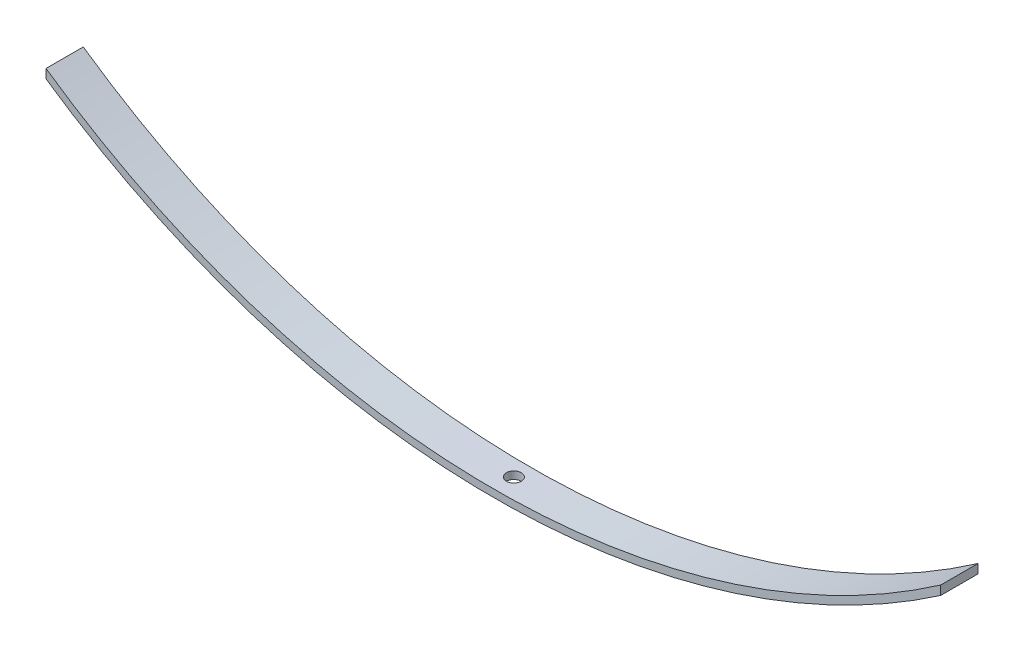
ISO-10303-21;
HEADER;
FILE_DESCRIPTION(('STEP AP214'),'2;1');
FILE_NAME('part.step','',(''),(''),'','','');
FILE_SCHEMA(('AUTOMOTIVE_DESIGN { 1 0 10303 214 1 1 1 1 }'));
ENDSEC;
DATA;
#1=APPLICATION_CONTEXT('core data for automotive mechanical design processes');
#2=APPLICATION_PROTOCOL_DEFINITION('international standard','automotive_design',2000,#1);
#3=PRODUCT_CONTEXT('',#1,'mechanical');
#4=PRODUCT('Part','Part','',(#3));
#5=PRODUCT_RELATED_PRODUCT_CATEGORY('part','',(#4));
#6=PRODUCT_DEFINITION_FORMATION('','',#4);
#7=PRODUCT_DEFINITION_CONTEXT('part definition',#1,'design');
#8=PRODUCT_DEFINITION('design','',#6,#7);
#9=PRODUCT_DEFINITION_SHAPE('','',#8);
#10=(LENGTH_UNIT() NAMED_UNIT(*) SI_UNIT(.MILLI.,.METRE.));
#11=(NAMED_UNIT(*) PLANE_ANGLE_UNIT() SI_UNIT($,.RADIAN.));
#12=(NAMED_UNIT(*) SI_UNIT($,.STERADIAN.) SOLID_ANGLE_UNIT());
#13=UNCERTAINTY_MEASURE_WITH_UNIT(LENGTH_MEASURE(1.E-05),#10,'distance_accuracy_value','');
#14=(GEOMETRIC_REPRESENTATION_CONTEXT(3) GLOBAL_UNCERTAINTY_ASSIGNED_CONTEXT((#13)) GLOBAL_UNIT_ASSIGNED_CONTEXT((#10,
#11,#12)) REPRESENTATION_CONTEXT('',''));
#15=CARTESIAN_POINT('',(0.,0.,0.));
#16=DIRECTION('',(0.,0.,1.));
#17=DIRECTION('',(1.,0.,0.));
#18=AXIS2_PLACEMENT_3D('',#15,#16,#17);
#19=CARTESIAN_POINT('',(-600.,-873.842090998139,50.));
#20=DIRECTION('',(-1.,0.,0.));
#21=DIRECTION('',(0.,-1.,0.));
#22=AXIS2_PLACEMENT_3D('',#19,#20,#21);
#23=PLANE('',#22);
#24=DIRECTION('',(0.,1.,0.));
#25=VECTOR('',#24,1.);
#26=CARTESIAN_POINT('',(-600.,-873.842090998139,0.));
#27=LINE('',#26,#25);
#28=CARTESIAN_POINT('',(-600.,-873.842090998139,0.));
#29=VERTEX_POINT('',#28);
#30=CARTESIAN_POINT('',(-600.,-861.684396980704,0.));
#31=VERTEX_POINT('',#30);
#32=EDGE_CURVE('E117',#29,#31,#27,.T.);
#33=ORIENTED_EDGE('',*,*,#32,.F.);
#34=DIRECTION('',(0.,0.,-1.));
#35=VECTOR('',#34,1.);
#36=CARTESIAN_POINT('',(-600.,-873.842090998139,50.));
#37=LINE('',#36,#35);
#38=CARTESIAN_POINT('',(-600.,-873.842090998139,50.));
#39=VERTEX_POINT('',#38);
#40=EDGE_CURVE('E11',#39,#29,#37,.T.);
#41=ORIENTED_EDGE('',*,*,#40,.F.);
#42=DIRECTION('',(0.,1.,0.));
#43=VECTOR('',#42,1.);
#44=CARTESIAN_POINT('',(-600.,-873.842090998139,50.));
#45=LINE('',#44,#43);
#46=CARTESIAN_POINT('',(-600.,-861.684396980704,50.));
#47=VERTEX_POINT('',#46);
#48=EDGE_CURVE('E109',#39,#47,#45,.T.);
#49=ORIENTED_EDGE('',*,*,#48,.T.);
#50=DIRECTION('',(0.,0.,-1.));
#51=VECTOR('',#50,1.);
#52=CARTESIAN_POINT('',(-600.,-861.684396980704,50.));
#53=LINE('',#52,#51);
#54=EDGE_CURVE('E85',#47,#31,#53,.T.);
#55=ORIENTED_EDGE('',*,*,#54,.T.);
#56=EDGE_LOOP('',(#33,#41,#49,#55));
#57=FACE_BOUND('',#56,.T.);
#58=ADVANCED_FACE('F39',(#57),#23,.T.);
#59=CARTESIAN_POINT('',(0.,0.,50.));
#60=DIRECTION('',(0.,0.,-1.));
#61=DIRECTION('',(-1.,0.,0.));
#62=AXIS2_PLACEMENT_3D('',#59,#60,#61);
#63=CYLINDRICAL_SURFACE('',#62,1060.);
#64=CARTESIAN_POINT('',(0.,-1060.,32.5));
#65=CARTESIAN_POINT('',(0.280946584348206,-1060.00000005311,32.5000020220934));
#66=CARTESIAN_POINT('',(0.56186000698558,-1059.99988806992,32.4881554885509));
#67=CARTESIAN_POINT('',(1.12178384017967,-1059.99944337889,32.4408520981594));
#68=CARTESIAN_POINT('',(1.40079373100566,-1059.99911061302,32.4053890348243));
#69=CARTESIAN_POINT('',(1.95512691926414,-1059.99823320531,32.3110456503398));
#70=CARTESIAN_POINT('',(2.23044597331775,-1059.99768833816,32.2521404262339));
#71=CARTESIAN_POINT('',(2.77514481562961,-1059.996402234,32.1113319083847));
#72=CARTESIAN_POINT('',(3.04452449859756,-1059.99566099352,32.0294282072885));
#73=CARTESIAN_POINT('',(3.5752887959038,-1059.9940036209,31.8432523644932));
#74=CARTESIAN_POINT('',(3.83667730994195,-1059.99308757571,31.7389913389032));
#75=CARTESIAN_POINT('',(4.34974481181648,-1059.99110634953,31.5088165525777));
#76=CARTESIAN_POINT('',(4.60142364640466,-1059.9900411662,31.382902450262));
#77=CARTESIAN_POINT('',(5.09321722992586,-1059.98779219393,31.1103516290593));
#78=CARTESIAN_POINT('',(5.33333480554242,-1059.98660843421,30.9637200103765));
#79=CARTESIAN_POINT('',(5.8003606571583,-1059.9841557098,30.6507563684889));
#80=CARTESIAN_POINT('',(6.02726921450707,-1059.98288674693,30.4844247651191));
#81=CARTESIAN_POINT('',(6.46630145618245,-1059.98029941738,30.1332156423847));
#82=CARTESIAN_POINT('',(6.67842302462288,-1059.97898104367,29.9483354780811));
#83=CARTESIAN_POINT('',(7.08633806907873,-1059.97633248349,29.561363072658));
#84=CARTESIAN_POINT('',(7.28213152827135,-1059.975002297,29.3592708138054));
#85=CARTESIAN_POINT('',(7.65600563784012,-1059.97236781821,28.9393027189671));
#86=CARTESIAN_POINT('',(7.8340855975412,-1059.97106352692,28.7214262681048));
#87=CARTESIAN_POINT('',(8.17125798978058,-1059.96851791795,28.2714456419832));
#88=CARTESIAN_POINT('',(8.33035042594166,-1059.96727660027,28.0393414694386));
#89=CARTESIAN_POINT('',(8.62841675297272,-1059.96489217678,27.5625553311994));
#90=CARTESIAN_POINT('',(8.76739064149245,-1059.963749071,27.3178733640354));
#91=CARTESIAN_POINT('',(9.02423174592911,-1059.96159352313,26.8176711092513));
#92=CARTESIAN_POINT('',(9.14209896111197,-1059.96058108105,26.5621508212542));
#93=CARTESIAN_POINT('',(9.35588838032539,-1059.95871560566,26.0420890694925));
#94=CARTESIAN_POINT('',(9.45181063206887,-1059.957862572,25.7775476253433));
#95=CARTESIAN_POINT('',(9.62102834409218,-1059.95634012899,25.2413238128445));
#96=CARTESIAN_POINT('',(9.69432380511083,-1059.95567071964,24.969641444728));
#97=CARTESIAN_POINT('',(9.81776495300685,-1059.95453454668,24.4210751591308));
#98=CARTESIAN_POINT('',(9.86791129425824,-1059.95406777733,24.1441913889122));
#99=CARTESIAN_POINT('',(9.94470064402974,-1059.95335010869,23.5871833899874));
#100=CARTESIAN_POINT('',(9.9713436529791,-1059.95309920939,23.3070591613404));
#101=CARTESIAN_POINT('',(10.0009368315469,-1059.9528204042,22.7455624456118));
#102=CARTESIAN_POINT('',(10.0038870484492,-1059.95279249787,22.4641899610224));
#103=CARTESIAN_POINT('',(9.98607378550728,-1059.9529604699,21.9021967050847));
#104=CARTESIAN_POINT('',(9.96531030609027,-1059.95315634825,21.6215759337227));
#105=CARTESIAN_POINT('',(9.90021834436419,-1059.95376631874,21.0630900864696));
#106=CARTESIAN_POINT('',(9.85589060514177,-1059.95418040401,20.7852249239632));
#107=CARTESIAN_POINT('',(9.74398580294951,-1059.95521502892,20.2342167248068));
#108=CARTESIAN_POINT('',(9.67640874052277,-1059.95583556856,19.9610736880465));
#109=CARTESIAN_POINT('',(9.51848572371814,-1059.95726548699,19.4214512112829));
#110=CARTESIAN_POINT('',(9.42813974349648,-1059.958074866,19.1549717788434));
#111=CARTESIAN_POINT('',(9.22532131348973,-1059.95985948679,18.6305711663604));
#112=CARTESIAN_POINT('',(9.11284886315724,-1059.96083472857,18.3726499865285));
#113=CARTESIAN_POINT('',(8.8665751949722,-1059.96292340768,17.8671953037659));
#114=CARTESIAN_POINT('',(8.73277363926302,-1059.96403684719,17.6196619654586));
#115=CARTESIAN_POINT('',(8.44479429713416,-1059.96637030295,17.1367468776052));
#116=CARTESIAN_POINT('',(8.29061651058448,-1059.9675903192,16.9013651281366));
#117=CARTESIAN_POINT('',(7.96298078682747,-1059.97010229707,16.4444264090993));
#118=CARTESIAN_POINT('',(7.78952285308146,-1059.97139425868,16.2228694370487));
#119=CARTESIAN_POINT('',(7.4245598551457,-1059.97401345524,15.7951550835713));
#120=CARTESIAN_POINT('',(7.23305479046283,-1059.97534069018,15.5889977025654));
#121=CARTESIAN_POINT('',(6.83335098118503,-1059.97799281239,15.1935401938286));
#122=CARTESIAN_POINT('',(6.62515158345991,-1059.97931769955,15.0042407262397));
#123=CARTESIAN_POINT('',(6.19354566028855,-1059.98192746531,14.6438538228687));
#124=CARTESIAN_POINT('',(5.97013913441568,-1059.98321234391,14.4727663875976));
#125=CARTESIAN_POINT('',(5.50970705525377,-1059.98570561966,14.1500198242902));
#126=CARTESIAN_POINT('',(5.27268149991302,-1059.98691401681,13.998360699181));
#127=CARTESIAN_POINT('',(4.7866963677902,-1059.98922002738,13.7155490281529));
#128=CARTESIAN_POINT('',(4.53773679115306,-1059.9903176408,13.584396481985));
#129=CARTESIAN_POINT('',(4.02965324006816,-1059.99237092721,13.3435303648615));
#130=CARTESIAN_POINT('',(3.77052925630749,-1059.99332660007,13.2338168135494));
#131=CARTESIAN_POINT('',(3.24395929545183,-1059.99506887533,13.0366089692603));
#132=CARTESIAN_POINT('',(2.97651331831506,-1059.99585547773,12.9491146763949));
#133=CARTESIAN_POINT('',(2.43520087718173,-1059.99723728213,12.7969675543235));
#134=CARTESIAN_POINT('',(2.16133441486457,-1059.99783248418,12.7323147191431));
#135=CARTESIAN_POINT('',(1.6091280955505,-1059.99881459158,12.6263102664249));
#136=CARTESIAN_POINT('',(1.33078823870042,-1059.99920149693,12.5849586481223));
#137=CARTESIAN_POINT('',(0.77162494237483,-1059.99975601669,12.5258518556675));
#138=CARTESIAN_POINT('',(0.490801599132531,-1059.99992363955,12.5080957712042));
#139=CARTESIAN_POINT('',(-0.071342710693692,-1060.00003486381,12.4963033565812));
#140=CARTESIAN_POINT('',(-0.352663677264907,-1059.9999784652,12.5022670258157));
#141=CARTESIAN_POINT('',(-0.91380311134412,-1059.99964324747,12.5378717052939));
#142=CARTESIAN_POINT('',(-1.19362157895722,-1059.99936442837,12.5675127138814));
#143=CARTESIAN_POINT('',(-1.74976663636781,-1059.99859228428,12.6502612785661));
#144=CARTESIAN_POINT('',(-2.02609322617277,-1059.9980989593,12.7033688346131));
#145=CARTESIAN_POINT('',(-2.57328511112292,-1059.99691181759,12.8326716784161));
#146=CARTESIAN_POINT('',(-2.84415050369338,-1059.99621800443,12.9088665539154));
#147=CARTESIAN_POINT('',(-3.3784995128294,-1059.99464957655,13.0838025768682));
#148=CARTESIAN_POINT('',(-3.64198312951571,-1059.99377496182,13.1825437239529));
#149=CARTESIAN_POINT('',(-4.15969558860484,-1059.99186975591,13.4018702365201));
#150=CARTESIAN_POINT('',(-4.41392443068157,-1059.99083916473,13.5224556027723));
#151=CARTESIAN_POINT('',(-4.91132018727455,-1059.98865125796,13.7846132433663));
#152=CARTESIAN_POINT('',(-5.15448710144171,-1059.98749394237,13.9261855183705));
#153=CARTESIAN_POINT('',(-5.62803778503295,-1059.98508539847,14.2293151696099));
#154=CARTESIAN_POINT('',(-5.85842116327858,-1059.98383416729,14.3908731569236));
#155=CARTESIAN_POINT('',(-6.30475909014677,-1059.98127333946,14.7328222943886));
#156=CARTESIAN_POINT('',(-6.52071363850222,-1059.97996374281,14.9132134448885));
#157=CARTESIAN_POINT('',(-6.93665894786419,-1059.97732335599,15.2915466762952));
#158=CARTESIAN_POINT('',(-7.13664969940709,-1059.97599256581,15.4894887676064));
#159=CARTESIAN_POINT('',(-7.5192456514605,-1059.97334756745,15.9015167263907));
#160=CARTESIAN_POINT('',(-7.70185085167683,-1059.97203335926,16.1156025941369));
#161=CARTESIAN_POINT('',(-8.04838312062709,-1059.96945878853,16.5584033356973));
#162=CARTESIAN_POINT('',(-8.21230959677797,-1059.96819842769,16.7871186732725));
#163=CARTESIAN_POINT('',(-8.52031230477512,-1059.96576737509,17.2575463569666));
#164=CARTESIAN_POINT('',(-8.66438853614721,-1059.96459668332,17.4992587033961));
#165=CARTESIAN_POINT('',(-8.93166623202528,-1059.96237820449,17.993961789564));
#166=CARTESIAN_POINT('',(-9.05486772032143,-1059.96133041729,18.2469525164484));
#167=CARTESIAN_POINT('',(-9.27952011671571,-1059.95938749238,18.7624140517701));
#168=CARTESIAN_POINT('',(-9.38097102538005,-1059.95849235466,19.0248848599605));
#169=CARTESIAN_POINT('',(-9.56139929543442,-1059.95688015591,19.5574359154949));
#170=CARTESIAN_POINT('',(-9.6403770458609,-1059.95616309178,19.8275160310241));
#171=CARTESIAN_POINT('',(-9.77529971900456,-1059.95492737776,20.3733699088328));
#172=CARTESIAN_POINT('',(-9.83124464187078,-1059.95440872787,20.6491436710755));
#173=CARTESIAN_POINT('',(-9.91970387457964,-1059.95358456646,21.2044245879638));
#174=CARTESIAN_POINT('',(-9.95221814740845,-1059.95327905529,21.4839317485063));
#175=CARTESIAN_POINT('',(-9.99358469808434,-1059.95288984673,22.0446917365487));
#176=CARTESIAN_POINT('',(-10.0024369765644,-1059.95280614934,22.3259445640019));
#177=CARTESIAN_POINT('',(-9.99641670711445,-1059.95286294336,22.8881846935362));
#178=CARTESIAN_POINT('',(-9.98154512565411,-1059.95300342563,23.1691720059672));
#179=CARTESIAN_POINT('',(-9.92818470658138,-1059.95350457372,23.7288949073403));
#180=CARTESIAN_POINT('',(-9.88969586959782,-1059.95386523952,24.0076304963423));
#181=CARTESIAN_POINT('',(-9.78937454164448,-1059.95479651649,24.5608688730521));
#182=CARTESIAN_POINT('',(-9.72754200392926,-1059.95536712809,24.8353716522825));
#183=CARTESIAN_POINT('',(-9.58097296960598,-1059.95670209778,25.3781923414521));
#184=CARTESIAN_POINT('',(-9.4962364731259,-1059.95746645588,25.6465102514259));
#185=CARTESIAN_POINT('',(-9.30446026916011,-1059.95916723565,26.1750586300429));
#186=CARTESIAN_POINT('',(-9.19742015033898,-1059.9601036605,26.4352889494288));
#187=CARTESIAN_POINT('',(-8.96179870770165,-1059.96212198139,26.945807068741));
#188=CARTESIAN_POINT('',(-8.83321737976848,-1059.96320387745,27.1960948667672));
#189=CARTESIAN_POINT('',(-8.55543309241778,-1059.96548238426,27.6849392266996));
#190=CARTESIAN_POINT('',(-8.40623093049,-1059.96667899057,27.9234962417984));
#191=CARTESIAN_POINT('',(-8.0882619807592,-1059.96915298728,28.3871935515233));
#192=CARTESIAN_POINT('',(-7.919495212128,-1059.97043037761,28.6123338592964));
#193=CARTESIAN_POINT('',(-7.56361013005285,-1059.97302958753,29.047581186366));
#194=CARTESIAN_POINT('',(-7.37649321444006,-1059.97435140374,29.2576893486376));
#195=CARTESIAN_POINT('',(-6.98522273545511,-1059.97700207468,29.661402395243));
#196=CARTESIAN_POINT('',(-6.78106880825639,-1059.97833092956,29.855006926962));
#197=CARTESIAN_POINT('',(-6.35712640594123,-1059.98095826128,30.2243772288435));
#198=CARTESIAN_POINT('',(-6.13733409524922,-1059.98225673057,30.4001385968402));
#199=CARTESIAN_POINT('',(-5.68372603551286,-1059.98478606453,30.7325157844114));
#200=CARTESIAN_POINT('',(-5.44991050778364,-1059.98601693026,30.8891319060188));
#201=CARTESIAN_POINT('',(-4.96979190737855,-1059.98837673623,31.1821832629788));
#202=CARTESIAN_POINT('',(-4.72348250297735,-1059.98950562395,31.3186081256654));
#203=CARTESIAN_POINT('',(-4.22024566651422,-1059.99162866155,31.5702075542553));
#204=CARTESIAN_POINT('',(-3.96331842261025,-1059.99262281379,31.6853824965295));
#205=CARTESIAN_POINT('',(-3.44094295376618,-1059.99444717367,31.8935548674749));
#206=CARTESIAN_POINT('',(-3.17550408838321,-1059.99527755464,31.9865757683566));
#207=CARTESIAN_POINT('',(-2.63782431812397,-1059.9967519617,32.1499132730886));
#208=CARTESIAN_POINT('',(-2.3655852197896,-1059.99739603671,32.2202358392719));
#209=CARTESIAN_POINT('',(-1.74756596681654,-1059.99861495653,32.3523694255879));
#210=CARTESIAN_POINT('',(-1.4003776449176,-1059.99913247613,32.4076838557039));
#211=CARTESIAN_POINT('',(-0.702108958754502,-1059.99982496467,32.4814978791332));
#212=CARTESIAN_POINT('',(-0.351028594601317,-1059.99999993364,32.4999974734963));
#213=CARTESIAN_POINT('',(0.,-1060.,32.5));
#214=B_SPLINE_CURVE_WITH_KNOTS('',3,(#64,#65,#66,#67,#68,#69,#70,#71,#72,#73,#74,#75,#76,#77,
#78,#79,#80,#81,#82,#83,#84,#85,#86,#87,#88,#89,#90,#91,#92,#93,#94,#95,#96,#97,#98,#99,#100,
#101,#102,#103,#104,#105,#106,#107,#108,#109,#110,#111,#112,#113,#114,#115,#116,#117,#118,#119,
#120,#121,#122,#123,#124,#125,#126,#127,#128,#129,#130,#131,#132,#133,#134,#135,#136,#137,#138,
#139,#140,#141,#142,#143,#144,#145,#146,#147,#148,#149,#150,#151,#152,#153,#154,#155,#156,#157,
#158,#159,#160,#161,#162,#163,#164,#165,#166,#167,#168,#169,#170,#171,#172,#173,#174,#175,#176,
#177,#178,#179,#180,#181,#182,#183,#184,#185,#186,#187,#188,#189,#190,#191,#192,#193,#194,#195,
#196,#197,#198,#199,#200,#201,#202,#203,#204,#205,#206,#207,#208,#209,#210,#211,#212,#213),
.UNSPECIFIED.,.T.,.F.,(4,2,2,2,2,2,2,2,2,2,2,2,2,2,2,2,2,2,2,2,2,2,2,2,2,2,2,2,2,2,2,2,2,2,2,2,
2,2,2,2,2,2,2,2,2,2,2,2,2,2,2,2,2,2,2,2,2,2,2,2,2,2,2,2,2,2,2,2,2,2,2,2,2,2,4),(0.,
0.842533127522199,1.68528776238952,2.52894006813992,3.37260731774666,4.21585606281373,
5.05911811146233,5.90217292778718,6.74520978063723,7.58836701797004,8.43152512399476,
9.27471609310212,10.1179069013305,10.9610978080598,11.8042887441143,12.6474778468784,
13.4906669221103,14.3338321608067,15.1769973841043,16.0201609246924,16.863324450092,
17.7064613883464,18.5495983069049,19.3927361824673,20.2358740788884,21.0790253320831,
21.9221765906567,22.765327697861,23.6084788281037,24.4516629609466,25.2948471174444,
26.1380314009692,26.9812156742553,27.8244007201085,28.6675857701942,29.5107705997325,
30.3539554015985,31.1971076726211,32.0402599221108,32.8834121126188,33.7265643013228,
34.5697014352434,35.412838555373,36.2559757052113,37.0991128816574,37.9422758440387,
38.7854388220288,39.628602299857,40.4717657919524,41.3149560259903,42.1581462801711,
43.0013355733934,43.8445248446662,44.6876995184663,45.5308741868106,46.3740501871311,
47.2172261648944,48.0603677939774,48.9035094006108,49.7466526956323,50.5897959859422,
51.4329548273309,52.2761138298647,53.1192402332035,53.9623658103501,54.8054272118197,
55.648506621533,56.4917935281745,57.3350671295189,58.1787724453379,59.0224628163214,
59.8652552805174,60.7078261819167,61.7605288826044,62.8132315532751),.UNSPECIFIED.);
#215=CARTESIAN_POINT('',(0.,-1060.,32.5));
#216=VERTEX_POINT('',#215);
#217=EDGE_CURVE('E122',#216,#216,#214,.T.);
#218=ORIENTED_EDGE('',*,*,#217,.T.);
#219=EDGE_LOOP('',(#218));
#220=FACE_BOUND('',#219,.T.);
#221=CARTESIAN_POINT('',(0.,0.,0.));
#222=DIRECTION('',(0.,0.,1.));
#223=DIRECTION('',(1.,0.,0.));
#224=AXIS2_PLACEMENT_3D('',#221,#222,#223);
#225=CIRCLE('',#224,1060.);
#226=CARTESIAN_POINT('',(600.,-873.842090998139,0.));
#227=VERTEX_POINT('',#226);
#228=EDGE_CURVE('E77',#29,#227,#225,.T.);
#229=ORIENTED_EDGE('',*,*,#228,.T.);
#230=DIRECTION('',(0.,0.,-1.));
#231=VECTOR('',#230,1.);
#232=CARTESIAN_POINT('',(600.,-873.842090998139,50.));
#233=LINE('',#232,#231);
#234=CARTESIAN_POINT('',(600.,-873.842090998139,50.));
#235=VERTEX_POINT('',#234);
#236=EDGE_CURVE('E53',#235,#227,#233,.T.);
#237=ORIENTED_EDGE('',*,*,#236,.F.);
#238=CARTESIAN_POINT('',(0.,0.,50.));
#239=DIRECTION('',(0.,0.,1.));
#240=DIRECTION('',(1.,0.,0.));
#241=AXIS2_PLACEMENT_3D('',#238,#239,#240);
#242=CIRCLE('',#241,1060.);
#243=EDGE_CURVE('E95',#39,#235,#242,.T.);
#244=ORIENTED_EDGE('',*,*,#243,.F.);
#245=ORIENTED_EDGE('',*,*,#40,.T.);
#246=EDGE_LOOP('',(#229,#237,#244,#245));
#247=FACE_BOUND('',#246,.T.);
#248=ADVANCED_FACE('F144',(#220,#247),#63,.T.);
#249=CARTESIAN_POINT('',(600.,-873.842090998139,50.));
#250=DIRECTION('',(-1.,0.,0.));
#251=DIRECTION('',(0.,0.,1.));
#252=AXIS2_PLACEMENT_3D('',#249,#250,#251);
#253=PLANE('',#252);
#254=DIRECTION('',(0.,1.,0.));
#255=VECTOR('',#254,1.);
#256=CARTESIAN_POINT('',(600.,-873.842090998139,0.));
#257=LINE('',#256,#255);
#258=CARTESIAN_POINT('',(600.,-861.684396980704,0.));
#259=VERTEX_POINT('',#258);
#260=EDGE_CURVE('E103',#227,#259,#257,.T.);
#261=ORIENTED_EDGE('',*,*,#260,.T.);
#262=DIRECTION('',(0.,0.,-1.));
#263=VECTOR('',#262,1.);
#264=CARTESIAN_POINT('',(600.,-861.684396980704,50.));
#265=LINE('',#264,#263);
#266=CARTESIAN_POINT('',(600.,-861.684396980704,50.));
#267=VERTEX_POINT('',#266);
#268=EDGE_CURVE('E100',#267,#259,#265,.T.);
#269=ORIENTED_EDGE('',*,*,#268,.F.);
#270=DIRECTION('',(0.,1.,0.));
#271=VECTOR('',#270,1.);
#272=CARTESIAN_POINT('',(600.,-873.842090998139,50.));
#273=LINE('',#272,#271);
#274=EDGE_CURVE('E90',#235,#267,#273,.T.);
#275=ORIENTED_EDGE('',*,*,#274,.F.);
#276=ORIENTED_EDGE('',*,*,#236,.T.);
#277=EDGE_LOOP('',(#261,#269,#275,#276));
#278=FACE_BOUND('',#277,.T.);
#279=ADVANCED_FACE('F101',(#278),#253,.F.);
#280=CARTESIAN_POINT('',(0.,0.,50.));
#281=DIRECTION('',(0.,0.,-1.));
#282=DIRECTION('',(-1.,0.,0.));
#283=AXIS2_PLACEMENT_3D('',#280,#281,#282);
#284=CYLINDRICAL_SURFACE('',#283,1050.);
#285=CARTESIAN_POINT('',(0.,-1050.,32.5));
#286=CARTESIAN_POINT('',(0.280946455707338,-1050.00000005362,32.5000020222119));
#287=CARTESIAN_POINT('',(0.561859748180041,-1049.99988700402,32.4881554994629));
#288=CARTESIAN_POINT('',(1.12178332012285,-1049.99943807825,32.4408521530473));
#289=CARTESIAN_POINT('',(1.4007930798701,-1049.9991021435,32.4053891229936));
#290=CARTESIAN_POINT('',(1.95512600058904,-1049.99821638034,32.3110458293668));
#291=CARTESIAN_POINT('',(2.23044491824481,-1049.99766632449,32.2521406632368));
#292=CARTESIAN_POINT('',(2.77514348860674,-1049.99636797292,32.1113322871698));
#293=CARTESIAN_POINT('',(3.04452303602068,-1049.99561967369,32.0294286698729));
#294=CARTESIAN_POINT('',(3.57528705945367,-1049.99394651809,31.8432530240047));
#295=CARTESIAN_POINT('',(3.83667543534891,-1049.99302174949,31.738992112036));
#296=CARTESIAN_POINT('',(4.34974266843324,-1049.99102165623,31.5088175820089));
#297=CARTESIAN_POINT('',(4.60142137237703,-1049.9899463292,31.382903622377));
#298=CARTESIAN_POINT('',(5.0932147093245,-1049.98767593996,31.1103531140938));
#299=CARTESIAN_POINT('',(5.33333216891936,-1049.98648090724,30.9637216654786));
#300=CARTESIAN_POINT('',(5.8003578070967,-1049.98400482525,30.6507583901235));
#301=CARTESIAN_POINT('',(6.02726626701966,-1049.98272377781,30.4844269832052));
#302=CARTESIAN_POINT('',(6.46629845526264,-1049.98011180774,30.1332181828166));
#303=CARTESIAN_POINT('',(6.67842005981523,-1049.97878087799,29.9483381345543));
#304=CARTESIAN_POINT('',(7.08633518849065,-1049.97610709293,29.5613659614718));
#305=CARTESIAN_POINT('',(7.28212869578543,-1049.97476423762,29.3592738189131));
#306=CARTESIAN_POINT('',(7.65600291613599,-1049.97210466749,28.9393059528157));
#307=CARTESIAN_POINT('',(7.83408293849946,-1049.97078795369,28.7214296143845));
#308=CARTESIAN_POINT('',(8.17125547160761,-1049.96821809919,28.2714492050629));
#309=CARTESIAN_POINT('',(8.33034798597325,-1049.96696495847,28.0393451368858));
#310=CARTESIAN_POINT('',(8.62841453809133,-1049.96455782356,27.5625591096344));
#311=CARTESIAN_POINT('',(8.76738856629714,-1049.96340382943,27.3178771445919));
#312=CARTESIAN_POINT('',(9.02422994840819,-1049.96122774919,26.8176748708692));
#313=CARTESIAN_POINT('',(9.14209730157277,-1049.96020566309,26.5621545618088));
#314=CARTESIAN_POINT('',(9.35588699117922,-1049.95832241782,26.042092745131));
#315=CARTESIAN_POINT('',(9.45180937539751,-1049.95746125831,25.7775512571551));
#316=CARTESIAN_POINT('',(9.62102734322767,-1049.95592431251,25.2413273347973));
#317=CARTESIAN_POINT('',(9.69432292759202,-1049.95524852622,24.9696449006529));
#318=CARTESIAN_POINT('',(9.8177642735964,-1049.95410152988,24.4210786221034));
#319=CARTESIAN_POINT('',(9.86791070297968,-1049.95363031393,24.1441949279699));
#320=CARTESIAN_POINT('',(9.9447002402635,-1049.95290580801,23.5871870686906));
#321=CARTESIAN_POINT('',(9.97134334860137,-1049.95265251804,23.307062903605));
#322=CARTESIAN_POINT('',(10.0009367352661,-1049.95237105535,22.7455663053535));
#323=CARTESIAN_POINT('',(10.0038870609635,-1049.95234288218,22.4641938746844));
#324=CARTESIAN_POINT('',(9.98607402424438,-1049.95251245194,21.9022007182391));
#325=CARTESIAN_POINT('',(9.96531066226272,-1049.95271019485,21.6215799924492));
#326=CARTESIAN_POINT('',(9.90021896407187,-1049.95332597264,21.0630944007939));
#327=CARTESIAN_POINT('',(9.85589138534057,-1049.95374400044,20.785229446636));
#328=CARTESIAN_POINT('',(9.74398694201719,-1049.95478847653,20.2342216524243));
#329=CARTESIAN_POINT('',(9.67641007797922,-1049.95541492481,19.961078812258));
#330=CARTESIAN_POINT('',(9.51848749602539,-1049.95685845891,19.4214567131349));
#331=CARTESIAN_POINT('',(9.42814175223163,-1049.95767554494,19.154977461752));
#332=CARTESIAN_POINT('',(9.22532383301546,-1049.95947715935,18.6305771915839));
#333=CARTESIAN_POINT('',(9.1128516570354,-1049.96046168774,18.3726561730145));
#334=CARTESIAN_POINT('',(8.86657853621652,-1049.96257025651,17.8672017090742));
#335=CARTESIAN_POINT('',(8.73277724692363,-1049.96369429916,17.6196684315415));
#336=CARTESIAN_POINT('',(8.44479845952952,-1049.96604997631,17.1367534412086));
#337=CARTESIAN_POINT('',(8.29062096129553,-1049.96728161083,16.9013717284877));
#338=CARTESIAN_POINT('',(7.96298583213824,-1049.9698175106,16.4444330524316));
#339=CARTESIAN_POINT('',(7.78952820459306,-1049.97112177585,16.2228760866743));
#340=CARTESIAN_POINT('',(7.42456583273651,-1049.97376591587,15.7951617109738));
#341=CARTESIAN_POINT('',(7.23306108792254,-1049.97510579064,15.5890043014595));
#342=CARTESIAN_POINT('',(6.83335777653577,-1049.97778317147,15.1935465486495));
#343=CARTESIAN_POINT('',(6.62515854437604,-1049.97912067743,15.004246878085));
#344=CARTESIAN_POINT('',(6.19355293096096,-1049.98175530006,14.6438595542777));
#345=CARTESIAN_POINT('',(5.9701465492709,-1049.98305241673,14.4727719015556));
#346=CARTESIAN_POINT('',(5.50971473309046,-1049.98556944054,14.1500248897845));
#347=CARTESIAN_POINT('',(5.27268929654317,-1049.98678934767,13.9983655336698));
#348=CARTESIAN_POINT('',(4.78670437328063,-1049.9891173234,13.715553389478));
#349=CARTESIAN_POINT('',(4.53774488671307,-1049.99022539201,13.5844006011471));
#350=CARTESIAN_POINT('',(4.02966147984637,-1049.99229823722,13.3435339897682));
#351=CARTESIAN_POINT('',(3.77053755004656,-1049.99326301369,13.2338201867596));
#352=CARTESIAN_POINT('',(3.24396766462543,-1049.99502188616,13.0366118365534));
#353=CARTESIAN_POINT('',(2.97652170896151,-1049.99581598215,12.9491172894694));
#354=CARTESIAN_POINT('',(2.43520928030631,-1049.99721095097,12.7969696614956));
#355=CARTESIAN_POINT('',(2.16134280902102,-1049.99781182386,12.7323165745366));
#356=CARTESIAN_POINT('',(1.60913644284852,-1049.99880328918,12.6263116248171));
#357=CARTESIAN_POINT('',(1.33079654811093,-1049.99919388161,12.5849597612773));
#358=CARTESIAN_POINT('',(0.771633357530493,-1049.99975368681,12.5258525104119));
#359=CARTESIAN_POINT('',(0.490810159763393,-1049.99992290827,12.5080961953549));
#360=CARTESIAN_POINT('',(-0.0713338800672139,-1050.00003519641,12.4963032972642));
#361=CARTESIAN_POINT('',(-0.352654722117769,-1049.99997826308,12.5022667136131));
#362=CARTESIAN_POINT('',(-0.913793926858859,-1049.99963985779,12.5378708665327));
#363=CARTESIAN_POINT('',(-1.19361228965781,-1049.99935838584,12.5675116013949));
#364=CARTESIAN_POINT('',(-1.74975715742404,-1049.99857889322,12.6502595985436));
#365=CARTESIAN_POINT('',(-2.02608366239895,-1049.99808087256,12.7033668607789));
#366=CARTESIAN_POINT('',(-2.57327530424166,-1049.99688243023,12.8326690749302));
#367=CARTESIAN_POINT('',(-2.84414054040393,-1049.99618201226,12.9088636066787));
#368=CARTESIAN_POINT('',(-3.37848926434953,-1049.99459865282,13.0837989071557));
#369=CARTESIAN_POINT('',(-3.64197275225591,-1049.99371571136,13.1825396755083));
#370=CARTESIAN_POINT('',(-4.15968498704243,-1049.99179236639,13.4018653973968));
#371=CARTESIAN_POINT('',(-4.41391373356709,-1049.99075196287,13.5224503517717));
#372=CARTESIAN_POINT('',(-4.91130933729704,-1049.98854322427,13.7846071377631));
#373=CARTESIAN_POINT('',(-5.15447619414652,-1049.98737488918,13.9261789700546));
#374=CARTESIAN_POINT('',(-5.62802694689876,-1049.98494341075,14.2293077982303));
#375=CARTESIAN_POINT('',(-5.85841044410617,-1049.98368026445,14.3908654169366));
#376=CARTESIAN_POINT('',(-6.30474864196582,-1049.9810950499,14.7328138176308));
#377=CARTESIAN_POINT('',(-6.52070334234587,-1049.97977298164,14.913204599974));
#378=CARTESIAN_POINT('',(-6.93664899281287,-1049.97710744908,15.2915371012534));
#379=CARTESIAN_POINT('',(-7.13663993337884,-1049.97576398476,15.4894788306572));
#380=CARTESIAN_POINT('',(-7.51923630203289,-1049.97309379529,15.9015060774159));
#381=CARTESIAN_POINT('',(-7.7018417298214,-1049.97176707014,16.1155915950492));
#382=CARTESIAN_POINT('',(-8.04837459762378,-1049.96916797675,16.5583917881049));
#383=CARTESIAN_POINT('',(-8.21230143382879,-1049.96789561027,16.7871069360755));
#384=CARTESIAN_POINT('',(-8.52030487628262,-1049.96544139976,17.2575342806249));
#385=CARTESIAN_POINT('',(-8.66438148204797,-1049.96425955572,17.4992464775201));
#386=CARTESIAN_POINT('',(-8.93165993678175,-1049.96201994239,17.9939493072439));
#387=CARTESIAN_POINT('',(-9.05486180957348,-1049.96096217295,18.2469399272004));
#388=CARTESIAN_POINT('',(-9.27951498017355,-1049.95900073701,18.7624012932254));
#389=CARTESIAN_POINT('',(-9.38096627855838,-1049.9580970705,19.0248720390426));
#390=CARTESIAN_POINT('',(-9.56139529837634,-1049.95646951022,19.5574229281056));
#391=CARTESIAN_POINT('',(-9.64037341612568,-1049.95574561326,19.8275029370692));
#392=CARTESIAN_POINT('',(-9.7752968327957,-1049.95449812308,20.373356641444));
#393=CARTESIAN_POINT('',(-9.83124213186879,-1049.95397452985,20.6491303368174));
#394=CARTESIAN_POINT('',(-9.91970212069303,-1049.95314251167,21.2044111568305));
#395=CARTESIAN_POINT('',(-9.95221677353112,-1049.95283408705,21.4839182873511));
#396=CARTESIAN_POINT('',(-9.99358408407556,-1049.95244116423,22.0446782504072));
#397=CARTESIAN_POINT('',(-10.0024367424272,-1049.95235666602,22.3259310828951));
#398=CARTESIAN_POINT('',(-9.99641723171441,-1049.95241399376,22.8881710448297));
#399=CARTESIAN_POINT('',(-9.98154604675068,-1049.95255581032,23.1691581848141));
#400=CARTESIAN_POINT('',(-9.9281864504988,-1049.95306172393,23.7288807736818));
#401=CARTESIAN_POINT('',(-9.88969803985204,-1049.95342582099,24.0076162226263));
#402=CARTESIAN_POINT('',(-9.78937759274778,-1049.95436596004,24.5608543526225));
#403=CARTESIAN_POINT('',(-9.72754550955411,-1049.95494200246,24.8353570251987));
#404=CARTESIAN_POINT('',(-9.5809774109943,-1049.95628967917,25.3781775365604));
#405=CARTESIAN_POINT('',(-9.49624139575051,-1049.95706131345,25.6464953753791));
#406=CARTESIAN_POINT('',(-9.30446617958453,-1049.95877828457,26.1750436494134));
#407=CARTESIAN_POINT('',(-9.1974265673862,-1049.9597236246,26.4352739353937));
#408=CARTESIAN_POINT('',(-8.96180616078762,-1049.96176116161,26.9457920304617));
#409=CARTESIAN_POINT('',(-8.83322536227233,-1049.96285335863,27.19607983765));
#410=CARTESIAN_POINT('',(-8.55544215221276,-1049.96515356032,27.6849242647077));
#411=CARTESIAN_POINT('',(-8.40624053805523,-1049.96636156051,27.9234813377097));
#412=CARTESIAN_POINT('',(-8.08827269766567,-1049.96885911491,28.387178816173));
#413=CARTESIAN_POINT('',(-7.91950649059289,-1049.97014866904,28.6123192347725));
#414=CARTESIAN_POINT('',(-7.56362240619957,-1049.97277263134,29.0475670034904));
#415=CARTESIAN_POINT('',(-7.37650591305131,-1049.97410703613,29.2576754854114));
#416=CARTESIAN_POINT('',(-6.98523625354987,-1049.97678295201,29.6613892080264));
#417=CARTESIAN_POINT('',(-6.78108272336355,-1049.97812446325,29.8549940961005));
#418=CARTESIAN_POINT('',(-6.35714108419319,-1049.98077681915,30.2243651471588));
#419=CARTESIAN_POINT('',(-6.13734913965536,-1049.98208765619,30.4001269080202));
#420=CARTESIAN_POINT('',(-5.6837417747051,-1049.98464108253,30.7325049167762));
#421=CARTESIAN_POINT('',(-5.44992657560482,-1049.98588367293,30.8891214666983));
#422=CARTESIAN_POINT('',(-4.96980851185209,-1049.98826595861,31.182173760291));
#423=CARTESIAN_POINT('',(-4.72349931146328,-1049.98940560087,31.3185991247778));
#424=CARTESIAN_POINT('',(-4.22026282877442,-1049.99154886486,31.5701995710202));
#425=CARTESIAN_POINT('',(-3.96333573463679,-1049.99255248901,31.6853750291534));
#426=CARTESIAN_POINT('',(-3.44096050604891,-1049.99439423178,31.8935484403447));
#427=CARTESIAN_POINT('',(-3.17552173111403,-1049.9952325254,31.9865698653506));
#428=CARTESIAN_POINT('',(-2.63784208614788,-1049.99672098326,32.1499084188951));
#429=CARTESIAN_POINT('',(-2.36560302265293,-1049.99737119689,32.2202315097007));
#430=CARTESIAN_POINT('',(-1.74758095181801,-1049.99860174161,32.3523668752272));
#431=CARTESIAN_POINT('',(-1.40038969678041,-1049.99912419891,32.4076822599008));
#432=CARTESIAN_POINT('',(-0.702115036795107,-1049.9998232946,32.4814975584148));
#433=CARTESIAN_POINT('',(-0.351031631960519,-1049.999999933,32.4999974733251));
#434=CARTESIAN_POINT('',(0.,-1050.,32.5));
#435=B_SPLINE_CURVE_WITH_KNOTS('',3,(#285,#286,#287,#288,#289,#290,#291,#292,#293,#294,#295,
#296,#297,#298,#299,#300,#301,#302,#303,#304,#305,#306,#307,#308,#309,#310,#311,#312,#313,#314,
#315,#316,#317,#318,#319,#320,#321,#322,#323,#324,#325,#326,#327,#328,#329,#330,#331,#332,#333,
#334,#335,#336,#337,#338,#339,#340,#341,#342,#343,#344,#345,#346,#347,#348,#349,#350,#351,#352,
#353,#354,#355,#356,#357,#358,#359,#360,#361,#362,#363,#364,#365,#366,#367,#368,#369,#370,#371,
#372,#373,#374,#375,#376,#377,#378,#379,#380,#381,#382,#383,#384,#385,#386,#387,#388,#389,#390,
#391,#392,#393,#394,#395,#396,#397,#398,#399,#400,#401,#402,#403,#404,#405,#406,#407,#408,#409,
#410,#411,#412,#413,#414,#415,#416,#417,#418,#419,#420,#421,#422,#423,#424,#425,#426,#427,#428,
#429,#430,#431,#432,#433,#434),.UNSPECIFIED.,.T.,.F.,(4,2,2,2,2,2,2,2,2,2,2,2,2,2,2,2,2,2,2,2,2,
2,2,2,2,2,2,2,2,2,2,2,2,2,2,2,2,2,2,2,2,2,2,2,2,2,2,2,2,2,2,2,2,2,2,2,2,2,2,2,2,2,2,2,2,2,2,2,2,
2,2,2,2,2,4),(0.,0.842532738890098,1.68528698170105,2.52893888148419,3.37260572538732,
4.21585404585456,5.05911566965727,5.90217006778509,6.74520650299582,7.58836377120745,
8.43152190838334,9.27471290948993,10.117903749798,10.9610949902169,11.8042862602247,
12.6474756945021,13.4906651007388,14.3338301834433,15.1769952504589,16.0201586316786,
16.8633219974387,17.7064582611317,18.5495945047305,19.3927317065978,20.2358689297147,
21.0790197704377,21.9221706166542,22.7653213151409,23.6084720371087,24.4516563911002,
25.2948407691953,26.1380252746389,26.9812097696474,27.8243950527948,28.6675803402571,
29.5107654036783,30.353950438898,31.197102320728,32.0402541806125,32.883405979659,
33.7265577768655,34.5696942303961,35.412830669872,36.255967141734,37.0991036407169,
37.9422664212011,38.7854292175908,39.6285925168489,40.4717558306356,41.3149463930042,
42.1581369759095,43.0013265965164,43.8445161947752,44.6876909224014,45.530865644448,
46.3740416948441,47.2172177222463,48.0603587743494,48.9034998035544,49.7466425208133,
50.5897852335676,51.4329434951666,52.2761019178352,53.1192277455109,53.9623527475353,
54.8054142010167,55.648493663041,56.4917806204093,57.3350542726939,58.1787599113769,
59.0224506049421,59.865243401117,60.7078146368584,61.760526443324,62.8132382191965),.UNSPECIFIED.);
#436=CARTESIAN_POINT('',(0.,-1050.,32.5));
#437=VERTEX_POINT('',#436);
#438=EDGE_CURVE('E42',#437,#437,#435,.T.);
#439=ORIENTED_EDGE('',*,*,#438,.F.);
#440=EDGE_LOOP('',(#439));
#441=FACE_BOUND('',#440,.T.);
#442=CARTESIAN_POINT('',(0.,0.,0.));
#443=DIRECTION('',(0.,0.,1.));
#444=DIRECTION('',(1.,0.,0.));
#445=AXIS2_PLACEMENT_3D('',#442,#443,#444);
#446=CIRCLE('',#445,1050.);
#447=EDGE_CURVE('E121',#31,#259,#446,.T.);
#448=ORIENTED_EDGE('',*,*,#447,.F.);
#449=ORIENTED_EDGE('',*,*,#54,.F.);
#450=CARTESIAN_POINT('',(0.,0.,50.));
#451=DIRECTION('',(0.,0.,1.));
#452=DIRECTION('',(1.,0.,0.));
#453=AXIS2_PLACEMENT_3D('',#450,#451,#452);
#454=CIRCLE('',#453,1050.);
#455=EDGE_CURVE('E94',#47,#267,#454,.T.);
#456=ORIENTED_EDGE('',*,*,#455,.T.);
#457=ORIENTED_EDGE('',*,*,#268,.T.);
#458=EDGE_LOOP('',(#448,#449,#456,#457));
#459=FACE_BOUND('',#458,.T.);
#460=ADVANCED_FACE('F107',(#441,#459),#284,.F.);
#461=CARTESIAN_POINT('',(0.,0.,50.));
#462=DIRECTION('',(0.,0.,1.));
#463=DIRECTION('',(1.,0.,0.));
#464=AXIS2_PLACEMENT_3D('',#461,#462,#463);
#465=PLANE('',#464);
#466=ORIENTED_EDGE('',*,*,#48,.F.);
#467=ORIENTED_EDGE('',*,*,#243,.T.);
#468=ORIENTED_EDGE('',*,*,#274,.T.);
#469=ORIENTED_EDGE('',*,*,#455,.F.);
#470=EDGE_LOOP('',(#466,#467,#468,#469));
#471=FACE_BOUND('',#470,.T.);
#472=ADVANCED_FACE('F93',(#471),#465,.T.);
#473=CARTESIAN_POINT('',(0.,0.,0.));
#474=DIRECTION('',(0.,0.,1.));
#475=DIRECTION('',(1.,0.,0.));
#476=AXIS2_PLACEMENT_3D('',#473,#474,#475);
#477=PLANE('',#476);
#478=ORIENTED_EDGE('',*,*,#32,.T.);
#479=ORIENTED_EDGE('',*,*,#447,.T.);
#480=ORIENTED_EDGE('',*,*,#260,.F.);
#481=ORIENTED_EDGE('',*,*,#228,.F.);
#482=EDGE_LOOP('',(#478,#479,#480,#481));
#483=FACE_BOUND('',#482,.T.);
#484=ADVANCED_FACE('F132',(#483),#477,.F.);
#485=CARTESIAN_POINT('',(0.,-1060.,22.5));
#486=DIRECTION('',(0.,1.,0.));
#487=DIRECTION('',(0.,0.,1.));
#488=AXIS2_PLACEMENT_3D('',#485,#486,#487);
#489=CYLINDRICAL_SURFACE('',#488,10.);
#490=ORIENTED_EDGE('',*,*,#438,.T.);
#491=EDGE_LOOP('',(#490));
#492=FACE_BOUND('',#491,.T.);
#493=ORIENTED_EDGE('',*,*,#217,.F.);
#494=EDGE_LOOP('',(#493));
#495=FACE_BOUND('',#494,.T.);
#496=ADVANCED_FACE('F134',(#492,#495),#489,.F.);
#497=CLOSED_SHELL('',(#58,#248,#279,#460,#472,#484,#496));
#498=MANIFOLD_SOLID_BREP('B2',#497);
#499=ADVANCED_BREP_SHAPE_REPRESENTATION('',(#18,#498),#14);
#500=SHAPE_DEFINITION_REPRESENTATION(#9,#499);
ENDSEC;
END-ISO-10303-21;
